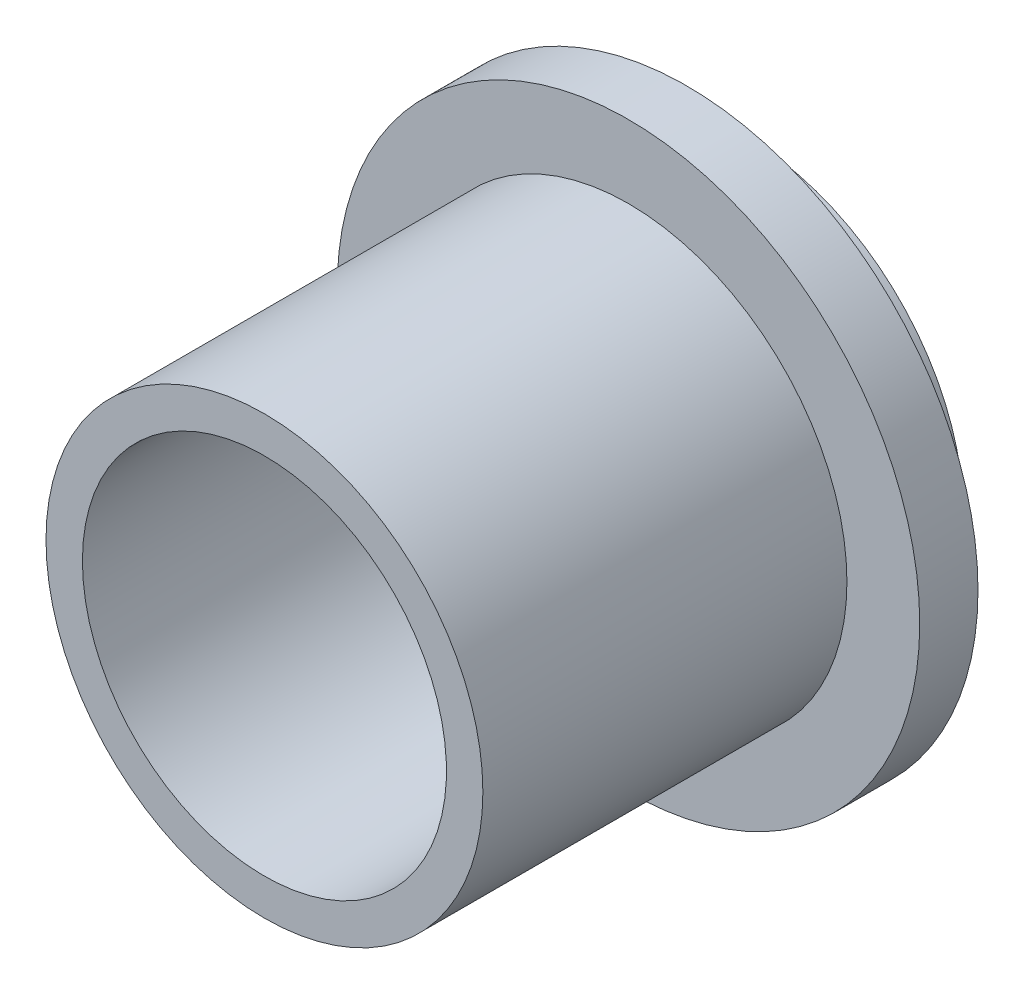
ISO-10303-21;
HEADER;
FILE_DESCRIPTION(('STEP AP214'),'2;1');
FILE_NAME('part.step','',(''),(''),'','','');
FILE_SCHEMA(('AUTOMOTIVE_DESIGN { 1 0 10303 214 1 1 1 1 }'));
ENDSEC;
DATA;
#1=APPLICATION_CONTEXT('core data for automotive mechanical design processes');
#2=APPLICATION_PROTOCOL_DEFINITION('international standard','automotive_design',2000,#1);
#3=PRODUCT_CONTEXT('',#1,'mechanical');
#4=PRODUCT('Part','Part','',(#3));
#5=PRODUCT_RELATED_PRODUCT_CATEGORY('part','',(#4));
#6=PRODUCT_DEFINITION_FORMATION('','',#4);
#7=PRODUCT_DEFINITION_CONTEXT('part definition',#1,'design');
#8=PRODUCT_DEFINITION('design','',#6,#7);
#9=PRODUCT_DEFINITION_SHAPE('','',#8);
#10=(LENGTH_UNIT() NAMED_UNIT(*) SI_UNIT(.MILLI.,.METRE.));
#11=(NAMED_UNIT(*) PLANE_ANGLE_UNIT() SI_UNIT($,.RADIAN.));
#12=(NAMED_UNIT(*) SI_UNIT($,.STERADIAN.) SOLID_ANGLE_UNIT());
#13=UNCERTAINTY_MEASURE_WITH_UNIT(LENGTH_MEASURE(1.E-05),#10,'distance_accuracy_value','');
#14=(GEOMETRIC_REPRESENTATION_CONTEXT(3) GLOBAL_UNCERTAINTY_ASSIGNED_CONTEXT((#13)) GLOBAL_UNIT_ASSIGNED_CONTEXT((#10,
#11,#12)) REPRESENTATION_CONTEXT('',''));
#15=CARTESIAN_POINT('',(0.,0.,0.));
#16=DIRECTION('',(0.,0.,1.));
#17=DIRECTION('',(1.,0.,0.));
#18=AXIS2_PLACEMENT_3D('',#15,#16,#17);
#19=CARTESIAN_POINT('',(0.,0.,-10.1599999999999));
#20=DIRECTION('',(0.,0.,-0.999999999999994));
#21=DIRECTION('',(-1.,0.,0.));
#22=AXIS2_PLACEMENT_3D('',#19,#20,#21);
#23=PLANE('',#22);
#24=CARTESIAN_POINT('',(0.,0.,-10.1599999999999));
#25=DIRECTION('',(0.,0.,-0.999999999999994));
#26=DIRECTION('',(-1.,0.,0.));
#27=AXIS2_PLACEMENT_3D('',#24,#25,#26);
#28=CIRCLE('',#27,50.8);
#29=CARTESIAN_POINT('',(50.8,0.,-10.1599999999999));
#30=VERTEX_POINT('',#29);
#31=EDGE_CURVE('E69',#30,#30,#28,.T.);
#32=ORIENTED_EDGE('',*,*,#31,.T.);
#33=EDGE_LOOP('',(#32));
#34=FACE_BOUND('',#33,.T.);
#35=CARTESIAN_POINT('',(0.,0.,-10.1599999999999));
#36=DIRECTION('',(0.,0.,-0.999999999999994));
#37=DIRECTION('',(-1.,0.,0.));
#38=AXIS2_PLACEMENT_3D('',#35,#36,#37);
#39=CIRCLE('',#38,38.1);
#40=CARTESIAN_POINT('',(38.1,0.,-10.1599999999999));
#41=VERTEX_POINT('',#40);
#42=EDGE_CURVE('E71',#41,#41,#39,.T.);
#43=ORIENTED_EDGE('',*,*,#42,.F.);
#44=EDGE_LOOP('',(#43));
#45=FACE_BOUND('',#44,.T.);
#46=ADVANCED_FACE('F50',(#34,#45),#23,.T.);
#47=CARTESIAN_POINT('',(0.,0.,63.499999999999));
#48=DIRECTION('',(0.,0.,0.999999999999994));
#49=DIRECTION('',(1.,0.,0.));
#50=AXIS2_PLACEMENT_3D('',#47,#48,#49);
#51=PLANE('',#50);
#52=CARTESIAN_POINT('',(0.,0.,63.499999999999));
#53=DIRECTION('',(0.,0.,0.999999999999994));
#54=DIRECTION('',(1.,0.,0.));
#55=AXIS2_PLACEMENT_3D('',#52,#53,#54);
#56=CIRCLE('',#55,38.1);
#57=CARTESIAN_POINT('',(-38.1,0.,63.499999999999));
#58=VERTEX_POINT('',#57);
#59=EDGE_CURVE('E10',#58,#58,#56,.T.);
#60=ORIENTED_EDGE('',*,*,#59,.T.);
#61=EDGE_LOOP('',(#60));
#62=FACE_BOUND('',#61,.T.);
#63=CARTESIAN_POINT('',(0.,0.,63.499999999999));
#64=DIRECTION('',(0.,0.,0.999999999999994));
#65=DIRECTION('',(1.,0.,0.));
#66=AXIS2_PLACEMENT_3D('',#63,#64,#65);
#67=CIRCLE('',#66,31.75);
#68=CARTESIAN_POINT('',(-31.75,0.,63.499999999999));
#69=VERTEX_POINT('',#68);
#70=EDGE_CURVE('E57',#69,#69,#67,.T.);
#71=ORIENTED_EDGE('',*,*,#70,.F.);
#72=EDGE_LOOP('',(#71));
#73=FACE_BOUND('',#72,.T.);
#74=ADVANCED_FACE('F106',(#62,#73),#51,.T.);
#75=CARTESIAN_POINT('',(0.,0.,63.499999999999));
#76=DIRECTION('',(0.,0.,-0.999999999999994));
#77=DIRECTION('',(-1.,0.,0.));
#78=AXIS2_PLACEMENT_3D('',#75,#76,#77);
#79=CYLINDRICAL_SURFACE('',#78,38.1);
#80=CARTESIAN_POINT('',(0.,0.,0.));
#81=DIRECTION('',(0.,0.,0.999999999999994));
#82=DIRECTION('',(1.,0.,0.));
#83=AXIS2_PLACEMENT_3D('',#80,#81,#82);
#84=CIRCLE('',#83,38.1);
#85=CARTESIAN_POINT('',(-38.1,0.,0.));
#86=VERTEX_POINT('',#85);
#87=EDGE_CURVE('E51',#86,#86,#84,.T.);
#88=CARTESIAN_POINT('',(-38.1,0.,63.499999999999));
#89=CARTESIAN_POINT('',(-38.1,0.,62.8385416666657));
#90=CARTESIAN_POINT('',(-38.1,0.,62.1770833333323));
#91=CARTESIAN_POINT('',(-38.1,0.,60.8541666666657));
#92=CARTESIAN_POINT('',(-38.1,0.,60.1927083333324));
#93=CARTESIAN_POINT('',(-38.1,0.,58.8697916666657));
#94=CARTESIAN_POINT('',(-38.1,0.,58.2083333333324));
#95=CARTESIAN_POINT('',(-38.1,0.,56.8854166666658));
#96=CARTESIAN_POINT('',(-38.1,0.,56.2239583333324));
#97=CARTESIAN_POINT('',(-38.1,0.,54.9010416666658));
#98=CARTESIAN_POINT('',(-38.1,0.,54.2395833333325));
#99=CARTESIAN_POINT('',(-38.1,0.,52.9166666666658));
#100=CARTESIAN_POINT('',(-38.1,0.,52.2552083333325));
#101=CARTESIAN_POINT('',(-38.1,0.,50.9322916666659));
#102=CARTESIAN_POINT('',(-38.1,0.,50.2708333333325));
#103=CARTESIAN_POINT('',(-38.1,0.,48.9479166666659));
#104=CARTESIAN_POINT('',(-38.1,0.,48.2864583333326));
#105=CARTESIAN_POINT('',(-38.1,0.,46.9635416666659));
#106=CARTESIAN_POINT('',(-38.1,0.,46.3020833333326));
#107=CARTESIAN_POINT('',(-38.1,0.,44.979166666666));
#108=CARTESIAN_POINT('',(-38.1,0.,44.3177083333326));
#109=CARTESIAN_POINT('',(-38.1,0.,42.994791666666));
#110=CARTESIAN_POINT('',(-38.1,0.,42.3333333333327));
#111=CARTESIAN_POINT('',(-38.1,0.,41.010416666666));
#112=CARTESIAN_POINT('',(-38.1,0.,40.3489583333327));
#113=CARTESIAN_POINT('',(-38.1,0.,39.0260416666661));
#114=CARTESIAN_POINT('',(-38.1,0.,38.3645833333327));
#115=CARTESIAN_POINT('',(-38.1,0.,37.0416666666661));
#116=CARTESIAN_POINT('',(-38.1,0.,36.3802083333328));
#117=CARTESIAN_POINT('',(-38.1,0.,35.0572916666661));
#118=CARTESIAN_POINT('',(-38.1,0.,34.3958333333328));
#119=CARTESIAN_POINT('',(-38.1,0.,33.0729166666661));
#120=CARTESIAN_POINT('',(-38.1,0.,32.4114583333328));
#121=CARTESIAN_POINT('',(-38.1,0.,31.0885416666662));
#122=CARTESIAN_POINT('',(-38.1,0.,30.4270833333328));
#123=CARTESIAN_POINT('',(-38.1,0.,29.1041666666662));
#124=CARTESIAN_POINT('',(-38.1,0.,28.4427083333329));
#125=CARTESIAN_POINT('',(-38.1,0.,27.1197916666662));
#126=CARTESIAN_POINT('',(-38.1,0.,26.4583333333329));
#127=CARTESIAN_POINT('',(-38.1,0.,25.1354166666663));
#128=CARTESIAN_POINT('',(-38.1,0.,24.4739583333329));
#129=CARTESIAN_POINT('',(-38.1,0.,23.1510416666663));
#130=CARTESIAN_POINT('',(-38.1,0.,22.489583333333));
#131=CARTESIAN_POINT('',(-38.1,0.,21.1666666666663));
#132=CARTESIAN_POINT('',(-38.1,0.,20.505208333333));
#133=CARTESIAN_POINT('',(-38.1,0.,19.1822916666664));
#134=CARTESIAN_POINT('',(-38.1,0.,18.520833333333));
#135=CARTESIAN_POINT('',(-38.1,0.,17.1979166666664));
#136=CARTESIAN_POINT('',(-38.1,0.,16.5364583333331));
#137=CARTESIAN_POINT('',(-38.1,0.,15.2135416666664));
#138=CARTESIAN_POINT('',(-38.1,0.,14.5520833333331));
#139=CARTESIAN_POINT('',(-38.1,0.,13.2291666666665));
#140=CARTESIAN_POINT('',(-38.1,0.,12.5677083333331));
#141=CARTESIAN_POINT('',(-38.1,0.,11.2447916666665));
#142=CARTESIAN_POINT('',(-38.1,0.,10.5833333333332));
#143=CARTESIAN_POINT('',(-38.1,0.,9.26041666666652));
#144=CARTESIAN_POINT('',(-38.1,0.,8.5989583333332));
#145=CARTESIAN_POINT('',(-38.1,0.,7.27604166666655));
#146=CARTESIAN_POINT('',(-38.1,0.,6.61458333333323));
#147=CARTESIAN_POINT('',(-38.1,0.,5.29166666666658));
#148=CARTESIAN_POINT('',(-38.1,0.,4.63020833333326));
#149=CARTESIAN_POINT('',(-38.1,0.,3.30729166666661));
#150=CARTESIAN_POINT('',(-38.1,0.,2.64583333333329));
#151=CARTESIAN_POINT('',(-38.1,0.,1.32291666666665));
#152=CARTESIAN_POINT('',(-38.1,0.,0.661458333333323));
#153=CARTESIAN_POINT('',(-38.1,0.,0.));
#154=B_SPLINE_CURVE_WITH_KNOTS('',3,(#88,#89,#90,#91,#92,#93,#94,#95,#96,#97,#98,#99,#100,#101,
#102,#103,#104,#105,#106,#107,#108,#109,#110,#111,#112,#113,#114,#115,#116,#117,#118,#119,#120,
#121,#122,#123,#124,#125,#126,#127,#128,#129,#130,#131,#132,#133,#134,#135,#136,#137,#138,#139,
#140,#141,#142,#143,#144,#145,#146,#147,#148,#149,#150,#151,#152,#153),.UNSPECIFIED.,.F.,.F.,(4,
2,2,2,2,2,2,2,2,2,2,2,2,2,2,2,2,2,2,2,2,2,2,2,2,2,2,2,2,2,2,2,4),(0.,1.98437499999998,
3.96874999999994,5.95312499999991,7.93749999999988,9.92187499999985,11.9062499999998,
13.8906249999998,15.8749999999998,17.8593749999997,19.8437499999997,21.8281249999997,
23.8124999999996,25.7968749999996,27.7812499999996,29.7656249999995,31.7499999999995,
33.7343749999995,35.7187499999994,37.7031249999994,39.6874999999994,41.6718749999994,
43.6562499999993,45.6406249999993,47.6249999999993,49.6093749999992,51.5937499999992,
53.5781249999992,55.5624999999991,57.5468749999991,59.5312499999991,61.515624999999,
63.499999999999),.UNSPECIFIED.);
#155=EDGE_CURVE('BSEAM47',#58,#86,#154,.T.);
#156=ORIENTED_EDGE('',*,*,#59,.F.);
#157=ORIENTED_EDGE('',*,*,#87,.T.);
#158=ORIENTED_EDGE('',*,*,#155,.T.);
#159=ORIENTED_EDGE('',*,*,#155,.F.);
#160=EDGE_LOOP('',(#156,#158,#157,#159));
#161=FACE_BOUND('',#160,.T.);
#162=ADVANCED_FACE('F47',(#161),#79,.T.);
#163=CARTESIAN_POINT('',(0.,0.,63.499999999999));
#164=DIRECTION('',(0.,0.,-0.999999999999994));
#165=DIRECTION('',(-1.,0.,0.));
#166=AXIS2_PLACEMENT_3D('',#163,#164,#165);
#167=CYLINDRICAL_SURFACE('',#166,31.75);
#168=CARTESIAN_POINT('',(0.,0.,-20.3199999999999));
#169=DIRECTION('',(0.,0.,-0.999999999999994));
#170=DIRECTION('',(-1.,0.,0.));
#171=AXIS2_PLACEMENT_3D('',#168,#169,#170);
#172=CIRCLE('',#171,31.75);
#173=CARTESIAN_POINT('',(-31.75,0.,-20.3199999999999));
#174=VERTEX_POINT('',#173);
#175=EDGE_CURVE('E79',#174,#174,#172,.T.);
#176=CARTESIAN_POINT('',(-31.75,0.,63.499999999999));
#177=CARTESIAN_POINT('',(-31.75,0.,62.626874999999));
#178=CARTESIAN_POINT('',(-31.75,0.,61.753749999999));
#179=CARTESIAN_POINT('',(-31.75,0.,60.007499999999));
#180=CARTESIAN_POINT('',(-31.75,0.,59.1343749999991));
#181=CARTESIAN_POINT('',(-31.75,0.,57.3881249999991));
#182=CARTESIAN_POINT('',(-31.75,0.,56.5149999999991));
#183=CARTESIAN_POINT('',(-31.75,0.,54.7687499999991));
#184=CARTESIAN_POINT('',(-31.75,0.,53.8956249999991));
#185=CARTESIAN_POINT('',(-31.75,0.,52.1493749999991));
#186=CARTESIAN_POINT('',(-31.75,0.,51.2762499999992));
#187=CARTESIAN_POINT('',(-31.75,0.,49.5299999999992));
#188=CARTESIAN_POINT('',(-31.75,0.,48.6568749999992));
#189=CARTESIAN_POINT('',(-31.75,0.,46.9106249999992));
#190=CARTESIAN_POINT('',(-31.75,0.,46.0374999999992));
#191=CARTESIAN_POINT('',(-31.75,0.,44.2912499999992));
#192=CARTESIAN_POINT('',(-31.75,0.,43.4181249999993));
#193=CARTESIAN_POINT('',(-31.75,0.,41.6718749999993));
#194=CARTESIAN_POINT('',(-31.75,0.,40.7987499999993));
#195=CARTESIAN_POINT('',(-31.75,0.,39.0524999999993));
#196=CARTESIAN_POINT('',(-31.75,0.,38.1793749999993));
#197=CARTESIAN_POINT('',(-31.75,0.,36.4331249999993));
#198=CARTESIAN_POINT('',(-31.75,0.,35.5599999999994));
#199=CARTESIAN_POINT('',(-31.75,0.,33.8137499999994));
#200=CARTESIAN_POINT('',(-31.75,0.,32.9406249999994));
#201=CARTESIAN_POINT('',(-31.75,0.,31.1943749999994));
#202=CARTESIAN_POINT('',(-31.75,0.,30.3212499999994));
#203=CARTESIAN_POINT('',(-31.75,0.,28.5749999999995));
#204=CARTESIAN_POINT('',(-31.75,0.,27.7018749999995));
#205=CARTESIAN_POINT('',(-31.75,0.,25.9556249999995));
#206=CARTESIAN_POINT('',(-31.75,0.,25.0824999999995));
#207=CARTESIAN_POINT('',(-31.75,0.,23.3362499999995));
#208=CARTESIAN_POINT('',(-31.75,0.,22.4631249999995));
#209=CARTESIAN_POINT('',(-31.75,0.,20.7168749999996));
#210=CARTESIAN_POINT('',(-31.75,0.,19.8437499999996));
#211=CARTESIAN_POINT('',(-31.75,0.,18.0974999999996));
#212=CARTESIAN_POINT('',(-31.75,0.,17.2243749999996));
#213=CARTESIAN_POINT('',(-31.75,0.,15.4781249999996));
#214=CARTESIAN_POINT('',(-31.75,0.,14.6049999999996));
#215=CARTESIAN_POINT('',(-31.75,0.,12.8587499999997));
#216=CARTESIAN_POINT('',(-31.75,0.,11.9856249999997));
#217=CARTESIAN_POINT('',(-31.75,0.,10.2393749999997));
#218=CARTESIAN_POINT('',(-31.75,0.,9.3662499999997));
#219=CARTESIAN_POINT('',(-31.75,0.,7.61999999999973));
#220=CARTESIAN_POINT('',(-31.75,0.,6.74687499999974));
#221=CARTESIAN_POINT('',(-31.75,0.,5.00062499999976));
#222=CARTESIAN_POINT('',(-31.75,0.,4.12749999999977));
#223=CARTESIAN_POINT('',(-31.75,0.,2.3812499999998));
#224=CARTESIAN_POINT('',(-31.75,0.,1.50812499999981));
#225=CARTESIAN_POINT('',(-31.75,0.,-0.238125000000163));
#226=CARTESIAN_POINT('',(-31.75,0.,-1.11125000000016));
#227=CARTESIAN_POINT('',(-31.75,0.,-2.85750000000013));
#228=CARTESIAN_POINT('',(-31.75,0.,-3.73062500000012));
#229=CARTESIAN_POINT('',(-31.75,0.,-5.47687500000009));
#230=CARTESIAN_POINT('',(-31.75,0.,-6.35000000000008));
#231=CARTESIAN_POINT('',(-31.75,0.,-8.09625000000005));
#232=CARTESIAN_POINT('',(-31.75,0.,-8.96937500000004));
#233=CARTESIAN_POINT('',(-31.75,0.,-10.715625));
#234=CARTESIAN_POINT('',(-31.75,0.,-11.58875));
#235=CARTESIAN_POINT('',(-31.75,0.,-13.335));
#236=CARTESIAN_POINT('',(-31.75,0.,-14.208125));
#237=CARTESIAN_POINT('',(-31.75,0.,-15.954375));
#238=CARTESIAN_POINT('',(-31.75,0.,-16.8275));
#239=CARTESIAN_POINT('',(-31.75,0.,-18.5737499999999));
#240=CARTESIAN_POINT('',(-31.75,0.,-19.4468749999999));
#241=CARTESIAN_POINT('',(-31.75,0.,-20.3199999999999));
#242=B_SPLINE_CURVE_WITH_KNOTS('',3,(#176,#177,#178,#179,#180,#181,#182,#183,#184,#185,#186,
#187,#188,#189,#190,#191,#192,#193,#194,#195,#196,#197,#198,#199,#200,#201,#202,#203,#204,#205,
#206,#207,#208,#209,#210,#211,#212,#213,#214,#215,#216,#217,#218,#219,#220,#221,#222,#223,#224,
#225,#226,#227,#228,#229,#230,#231,#232,#233,#234,#235,#236,#237,#238,#239,#240,#241),
.UNSPECIFIED.,.F.,.F.,(4,2,2,2,2,2,2,2,2,2,2,2,2,2,2,2,2,2,2,2,2,2,2,2,2,2,2,2,2,2,2,2,4),(0.,
2.61937499999997,5.23874999999994,7.8581249999999,10.4774999999999,13.0968749999998,
15.7162499999998,18.3356249999998,20.9549999999997,23.5743749999997,26.1937499999997,
28.8131249999996,31.4324999999996,34.0518749999996,36.6712499999995,39.2906249999995,
41.9099999999995,44.5293749999994,47.1487499999994,49.7681249999994,52.3874999999993,
55.0068749999993,57.6262499999992,60.2456249999992,62.8649999999992,65.4843749999991,
68.1037499999991,70.7231249999991,73.342499999999,75.961874999999,78.581249999999,
81.200624999999,83.8199999999989),.UNSPECIFIED.);
#243=EDGE_CURVE('BSEAM88',#69,#174,#242,.T.);
#244=ORIENTED_EDGE('',*,*,#70,.T.);
#245=ORIENTED_EDGE('',*,*,#175,.T.);
#246=ORIENTED_EDGE('',*,*,#243,.T.);
#247=ORIENTED_EDGE('',*,*,#243,.F.);
#248=EDGE_LOOP('',(#244,#246,#245,#247));
#249=FACE_BOUND('',#248,.T.);
#250=ADVANCED_FACE('F88',(#249),#167,.F.);
#251=CARTESIAN_POINT('',(0.,0.,-10.1599999999999));
#252=DIRECTION('',(0.,0.,0.999999999999994));
#253=DIRECTION('',(1.,0.,0.));
#254=AXIS2_PLACEMENT_3D('',#251,#252,#253);
#255=CYLINDRICAL_SURFACE('',#254,50.8);
#256=CARTESIAN_POINT('',(0.,0.,0.));
#257=DIRECTION('',(0.,0.,-0.999999999999994));
#258=DIRECTION('',(-1.,0.,0.));
#259=AXIS2_PLACEMENT_3D('',#256,#257,#258);
#260=CIRCLE('',#259,50.8);
#261=CARTESIAN_POINT('',(50.8,0.,0.));
#262=VERTEX_POINT('',#261);
#263=EDGE_CURVE('E65',#262,#262,#260,.T.);
#264=CARTESIAN_POINT('',(50.8,0.,-10.1599999999999));
#265=CARTESIAN_POINT('',(50.8,0.,-10.0541666666666));
#266=CARTESIAN_POINT('',(50.8,0.,-9.94833333333328));
#267=CARTESIAN_POINT('',(50.8,0.,-9.73666666666661));
#268=CARTESIAN_POINT('',(50.8,0.,-9.63083333333328));
#269=CARTESIAN_POINT('',(50.8,0.,-9.41916666666662));
#270=CARTESIAN_POINT('',(50.8,0.,-9.31333333333328));
#271=CARTESIAN_POINT('',(50.8,0.,-9.10166666666662));
#272=CARTESIAN_POINT('',(50.8,0.,-8.99583333333329));
#273=CARTESIAN_POINT('',(50.8,0.,-8.78416666666662));
#274=CARTESIAN_POINT('',(50.8,0.,-8.67833333333329));
#275=CARTESIAN_POINT('',(50.8,0.,-8.46666666666662));
#276=CARTESIAN_POINT('',(50.8,0.,-8.36083333333329));
#277=CARTESIAN_POINT('',(50.8,0.,-8.14916666666662));
#278=CARTESIAN_POINT('',(50.8,0.,-8.04333333333329));
#279=CARTESIAN_POINT('',(50.8,0.,-7.83166666666663));
#280=CARTESIAN_POINT('',(50.8,0.,-7.72583333333329));
#281=CARTESIAN_POINT('',(50.8,0.,-7.51416666666663));
#282=CARTESIAN_POINT('',(50.8,0.,-7.40833333333329));
#283=CARTESIAN_POINT('',(50.8,0.,-7.19666666666663));
#284=CARTESIAN_POINT('',(50.8,0.,-7.0908333333333));
#285=CARTESIAN_POINT('',(50.8,0.,-6.87916666666663));
#286=CARTESIAN_POINT('',(50.8,0.,-6.7733333333333));
#287=CARTESIAN_POINT('',(50.8,0.,-6.56166666666663));
#288=CARTESIAN_POINT('',(50.8,0.,-6.4558333333333));
#289=CARTESIAN_POINT('',(50.8,0.,-6.24416666666663));
#290=CARTESIAN_POINT('',(50.8,0.,-6.1383333333333));
#291=CARTESIAN_POINT('',(50.8,0.,-5.92666666666664));
#292=CARTESIAN_POINT('',(50.8,0.,-5.8208333333333));
#293=CARTESIAN_POINT('',(50.8,0.,-5.60916666666664));
#294=CARTESIAN_POINT('',(50.8,0.,-5.5033333333333));
#295=CARTESIAN_POINT('',(50.8,0.,-5.29166666666664));
#296=CARTESIAN_POINT('',(50.8,0.,-5.18583333333331));
#297=CARTESIAN_POINT('',(50.8,0.,-4.97416666666664));
#298=CARTESIAN_POINT('',(50.8,0.,-4.86833333333331));
#299=CARTESIAN_POINT('',(50.8,0.,-4.65666666666664));
#300=CARTESIAN_POINT('',(50.8,0.,-4.55083333333331));
#301=CARTESIAN_POINT('',(50.8,0.,-4.33916666666665));
#302=CARTESIAN_POINT('',(50.8,0.,-4.23333333333331));
#303=CARTESIAN_POINT('',(50.8,0.,-4.02166666666665));
#304=CARTESIAN_POINT('',(50.8,0.,-3.91583333333331));
#305=CARTESIAN_POINT('',(50.8,0.,-3.70416666666665));
#306=CARTESIAN_POINT('',(50.8,0.,-3.59833333333332));
#307=CARTESIAN_POINT('',(50.8,0.,-3.38666666666665));
#308=CARTESIAN_POINT('',(50.8,0.,-3.28083333333332));
#309=CARTESIAN_POINT('',(50.8,0.,-3.06916666666665));
#310=CARTESIAN_POINT('',(50.8,0.,-2.96333333333332));
#311=CARTESIAN_POINT('',(50.8,0.,-2.75166666666665));
#312=CARTESIAN_POINT('',(50.8,0.,-2.64583333333332));
#313=CARTESIAN_POINT('',(50.8,0.,-2.43416666666666));
#314=CARTESIAN_POINT('',(50.8,0.,-2.32833333333332));
#315=CARTESIAN_POINT('',(50.8,0.,-2.11666666666666));
#316=CARTESIAN_POINT('',(50.8,0.,-2.01083333333332));
#317=CARTESIAN_POINT('',(50.8,0.,-1.79916666666666));
#318=CARTESIAN_POINT('',(50.8,0.,-1.69333333333333));
#319=CARTESIAN_POINT('',(50.8,0.,-1.48166666666666));
#320=CARTESIAN_POINT('',(50.8,0.,-1.37583333333333));
#321=CARTESIAN_POINT('',(50.8,0.,-1.16416666666666));
#322=CARTESIAN_POINT('',(50.8,0.,-1.05833333333333));
#323=CARTESIAN_POINT('',(50.8,0.,-0.846666666666662));
#324=CARTESIAN_POINT('',(50.8,0.,-0.740833333333329));
#325=CARTESIAN_POINT('',(50.8,0.,-0.529166666666664));
#326=CARTESIAN_POINT('',(50.8,0.,-0.423333333333331));
#327=CARTESIAN_POINT('',(50.8,0.,-0.211666666666666));
#328=CARTESIAN_POINT('',(50.8,0.,-0.105833333333333));
#329=CARTESIAN_POINT('',(50.8,0.,0.));
#330=B_SPLINE_CURVE_WITH_KNOTS('',3,(#264,#265,#266,#267,#268,#269,#270,#271,#272,#273,#274,
#275,#276,#277,#278,#279,#280,#281,#282,#283,#284,#285,#286,#287,#288,#289,#290,#291,#292,#293,
#294,#295,#296,#297,#298,#299,#300,#301,#302,#303,#304,#305,#306,#307,#308,#309,#310,#311,#312,
#313,#314,#315,#316,#317,#318,#319,#320,#321,#322,#323,#324,#325,#326,#327,#328,#329),
.UNSPECIFIED.,.F.,.F.,(4,2,2,2,2,2,2,2,2,2,2,2,2,2,2,2,2,2,2,2,2,2,2,2,2,2,2,2,2,2,2,2,4),(0.,
0.317499999999997,0.634999999999995,0.952499999999993,1.26999999999999,1.58749999999999,
1.90499999999999,2.22249999999999,2.53999999999998,2.85749999999998,3.17499999999998,
3.49249999999998,3.80999999999998,4.12749999999998,4.44499999999998,4.76249999999997,
5.07999999999997,5.39749999999997,5.71499999999997,6.03249999999997,6.34999999999996,
6.66749999999996,6.98499999999996,7.30249999999996,7.61999999999996,7.93749999999996,
8.25499999999995,8.57249999999995,8.88999999999995,9.20749999999995,9.52499999999995,
9.84249999999995,10.1599999999999),.UNSPECIFIED.);
#331=EDGE_CURVE('BSEAM105',#30,#262,#330,.T.);
#332=ORIENTED_EDGE('',*,*,#31,.F.);
#333=ORIENTED_EDGE('',*,*,#263,.T.);
#334=ORIENTED_EDGE('',*,*,#331,.T.);
#335=ORIENTED_EDGE('',*,*,#331,.F.);
#336=EDGE_LOOP('',(#332,#334,#333,#335));
#337=FACE_BOUND('',#336,.T.);
#338=ADVANCED_FACE('F105',(#337),#255,.T.);
#339=CARTESIAN_POINT('',(0.,0.,0.));
#340=DIRECTION('',(0.,0.,-0.999999999999994));
#341=DIRECTION('',(-1.,0.,0.));
#342=AXIS2_PLACEMENT_3D('',#339,#340,#341);
#343=PLANE('',#342);
#344=ORIENTED_EDGE('',*,*,#87,.F.);
#345=EDGE_LOOP('',(#344));
#346=FACE_BOUND('',#345,.T.);
#347=ORIENTED_EDGE('',*,*,#263,.F.);
#348=EDGE_LOOP('',(#347));
#349=FACE_BOUND('',#348,.T.);
#350=ADVANCED_FACE('F93',(#346,#349),#343,.F.);
#351=CARTESIAN_POINT('',(0.,0.,-20.3199999999999));
#352=DIRECTION('',(0.,0.,-0.999999999999994));
#353=DIRECTION('',(-1.,0.,0.));
#354=AXIS2_PLACEMENT_3D('',#351,#352,#353);
#355=PLANE('',#354);
#356=CARTESIAN_POINT('',(0.,0.,-20.3199999999999));
#357=DIRECTION('',(0.,0.,-0.999999999999994));
#358=DIRECTION('',(-1.,0.,0.));
#359=AXIS2_PLACEMENT_3D('',#356,#357,#358);
#360=CIRCLE('',#359,38.1);
#361=CARTESIAN_POINT('',(38.1,0.,-20.3199999999999));
#362=VERTEX_POINT('',#361);
#363=EDGE_CURVE('E66',#362,#362,#360,.T.);
#364=ORIENTED_EDGE('',*,*,#363,.T.);
#365=EDGE_LOOP('',(#364));
#366=FACE_BOUND('',#365,.T.);
#367=ORIENTED_EDGE('',*,*,#175,.F.);
#368=EDGE_LOOP('',(#367));
#369=FACE_BOUND('',#368,.T.);
#370=ADVANCED_FACE('F86',(#366,#369),#355,.T.);
#371=CARTESIAN_POINT('',(0.,0.,-20.3199999999999));
#372=DIRECTION('',(0.,0.,0.999999999999994));
#373=DIRECTION('',(1.,0.,0.));
#374=AXIS2_PLACEMENT_3D('',#371,#372,#373);
#375=CYLINDRICAL_SURFACE('',#374,38.1);
#376=CARTESIAN_POINT('',(38.1,0.,-20.3199999999999));
#377=CARTESIAN_POINT('',(38.1,0.,-20.2141666666666));
#378=CARTESIAN_POINT('',(38.1,0.,-20.1083333333332));
#379=CARTESIAN_POINT('',(38.1,0.,-19.8966666666666));
#380=CARTESIAN_POINT('',(38.1,0.,-19.7908333333332));
#381=CARTESIAN_POINT('',(38.1,0.,-19.5791666666666));
#382=CARTESIAN_POINT('',(38.1,0.,-19.4733333333332));
#383=CARTESIAN_POINT('',(38.1,0.,-19.2616666666666));
#384=CARTESIAN_POINT('',(38.1,0.,-19.1558333333332));
#385=CARTESIAN_POINT('',(38.1,0.,-18.9441666666666));
#386=CARTESIAN_POINT('',(38.1,0.,-18.8383333333332));
#387=CARTESIAN_POINT('',(38.1,0.,-18.6266666666666));
#388=CARTESIAN_POINT('',(38.1,0.,-18.5208333333332));
#389=CARTESIAN_POINT('',(38.1,0.,-18.3091666666666));
#390=CARTESIAN_POINT('',(38.1,0.,-18.2033333333332));
#391=CARTESIAN_POINT('',(38.1,0.,-17.9916666666666));
#392=CARTESIAN_POINT('',(38.1,0.,-17.8858333333332));
#393=CARTESIAN_POINT('',(38.1,0.,-17.6741666666666));
#394=CARTESIAN_POINT('',(38.1,0.,-17.5683333333332));
#395=CARTESIAN_POINT('',(38.1,0.,-17.3566666666666));
#396=CARTESIAN_POINT('',(38.1,0.,-17.2508333333332));
#397=CARTESIAN_POINT('',(38.1,0.,-17.0391666666666));
#398=CARTESIAN_POINT('',(38.1,0.,-16.9333333333332));
#399=CARTESIAN_POINT('',(38.1,0.,-16.7216666666666));
#400=CARTESIAN_POINT('',(38.1,0.,-16.6158333333332));
#401=CARTESIAN_POINT('',(38.1,0.,-16.4041666666666));
#402=CARTESIAN_POINT('',(38.1,0.,-16.2983333333332));
#403=CARTESIAN_POINT('',(38.1,0.,-16.0866666666666));
#404=CARTESIAN_POINT('',(38.1,0.,-15.9808333333332));
#405=CARTESIAN_POINT('',(38.1,0.,-15.7691666666666));
#406=CARTESIAN_POINT('',(38.1,0.,-15.6633333333333));
#407=CARTESIAN_POINT('',(38.1,0.,-15.4516666666666));
#408=CARTESIAN_POINT('',(38.1,0.,-15.3458333333333));
#409=CARTESIAN_POINT('',(38.1,0.,-15.1341666666666));
#410=CARTESIAN_POINT('',(38.1,0.,-15.0283333333333));
#411=CARTESIAN_POINT('',(38.1,0.,-14.8166666666666));
#412=CARTESIAN_POINT('',(38.1,0.,-14.7108333333333));
#413=CARTESIAN_POINT('',(38.1,0.,-14.4991666666666));
#414=CARTESIAN_POINT('',(38.1,0.,-14.3933333333333));
#415=CARTESIAN_POINT('',(38.1,0.,-14.1816666666666));
#416=CARTESIAN_POINT('',(38.1,0.,-14.0758333333333));
#417=CARTESIAN_POINT('',(38.1,0.,-13.8641666666666));
#418=CARTESIAN_POINT('',(38.1,0.,-13.7583333333333));
#419=CARTESIAN_POINT('',(38.1,0.,-13.5466666666666));
#420=CARTESIAN_POINT('',(38.1,0.,-13.4408333333333));
#421=CARTESIAN_POINT('',(38.1,0.,-13.2291666666666));
#422=CARTESIAN_POINT('',(38.1,0.,-13.1233333333333));
#423=CARTESIAN_POINT('',(38.1,0.,-12.9116666666666));
#424=CARTESIAN_POINT('',(38.1,0.,-12.8058333333333));
#425=CARTESIAN_POINT('',(38.1,0.,-12.5941666666666));
#426=CARTESIAN_POINT('',(38.1,0.,-12.4883333333333));
#427=CARTESIAN_POINT('',(38.1,0.,-12.2766666666666));
#428=CARTESIAN_POINT('',(38.1,0.,-12.1708333333333));
#429=CARTESIAN_POINT('',(38.1,0.,-11.9591666666666));
#430=CARTESIAN_POINT('',(38.1,0.,-11.8533333333333));
#431=CARTESIAN_POINT('',(38.1,0.,-11.6416666666666));
#432=CARTESIAN_POINT('',(38.1,0.,-11.5358333333333));
#433=CARTESIAN_POINT('',(38.1,0.,-11.3241666666666));
#434=CARTESIAN_POINT('',(38.1,0.,-11.2183333333333));
#435=CARTESIAN_POINT('',(38.1,0.,-11.0066666666666));
#436=CARTESIAN_POINT('',(38.1,0.,-10.9008333333333));
#437=CARTESIAN_POINT('',(38.1,0.,-10.6891666666666));
#438=CARTESIAN_POINT('',(38.1,0.,-10.5833333333333));
#439=CARTESIAN_POINT('',(38.1,0.,-10.3716666666666));
#440=CARTESIAN_POINT('',(38.1,0.,-10.2658333333333));
#441=CARTESIAN_POINT('',(38.1,0.,-10.1599999999999));
#442=B_SPLINE_CURVE_WITH_KNOTS('',3,(#376,#377,#378,#379,#380,#381,#382,#383,#384,#385,#386,
#387,#388,#389,#390,#391,#392,#393,#394,#395,#396,#397,#398,#399,#400,#401,#402,#403,#404,#405,
#406,#407,#408,#409,#410,#411,#412,#413,#414,#415,#416,#417,#418,#419,#420,#421,#422,#423,#424,
#425,#426,#427,#428,#429,#430,#431,#432,#433,#434,#435,#436,#437,#438,#439,#440,#441),
.UNSPECIFIED.,.F.,.F.,(4,2,2,2,2,2,2,2,2,2,2,2,2,2,2,2,2,2,2,2,2,2,2,2,2,2,2,2,2,2,2,2,4),(0.,
0.317499999999995,0.634999999999993,0.952499999999992,1.26999999999999,1.58749999999999,
1.90499999999999,2.22249999999999,2.53999999999998,2.85749999999998,3.17499999999998,
3.49249999999998,3.80999999999998,4.12749999999997,4.44499999999997,4.76249999999997,
5.07999999999997,5.39749999999997,5.71499999999997,6.03249999999997,6.34999999999996,
6.66749999999996,6.98499999999996,7.30249999999996,7.61999999999996,7.93749999999995,
8.25499999999995,8.57249999999995,8.88999999999995,9.20749999999995,9.52499999999995,
9.84249999999994,10.1599999999999),.UNSPECIFIED.);
#443=EDGE_CURVE('BSEAM89',#362,#41,#442,.T.);
#444=ORIENTED_EDGE('',*,*,#363,.F.);
#445=ORIENTED_EDGE('',*,*,#42,.T.);
#446=ORIENTED_EDGE('',*,*,#443,.T.);
#447=ORIENTED_EDGE('',*,*,#443,.F.);
#448=EDGE_LOOP('',(#444,#446,#445,#447));
#449=FACE_BOUND('',#448,.T.);
#450=ADVANCED_FACE('F89',(#449),#375,.T.);
#451=CLOSED_SHELL('',(#46,#74,#162,#250,#338,#350,#370,#450));
#452=MANIFOLD_SOLID_BREP('B2',#451);
#453=ADVANCED_BREP_SHAPE_REPRESENTATION('',(#18,#452),#14);
#454=SHAPE_DEFINITION_REPRESENTATION(#9,#453);
ENDSEC;
END-ISO-10303-21;
